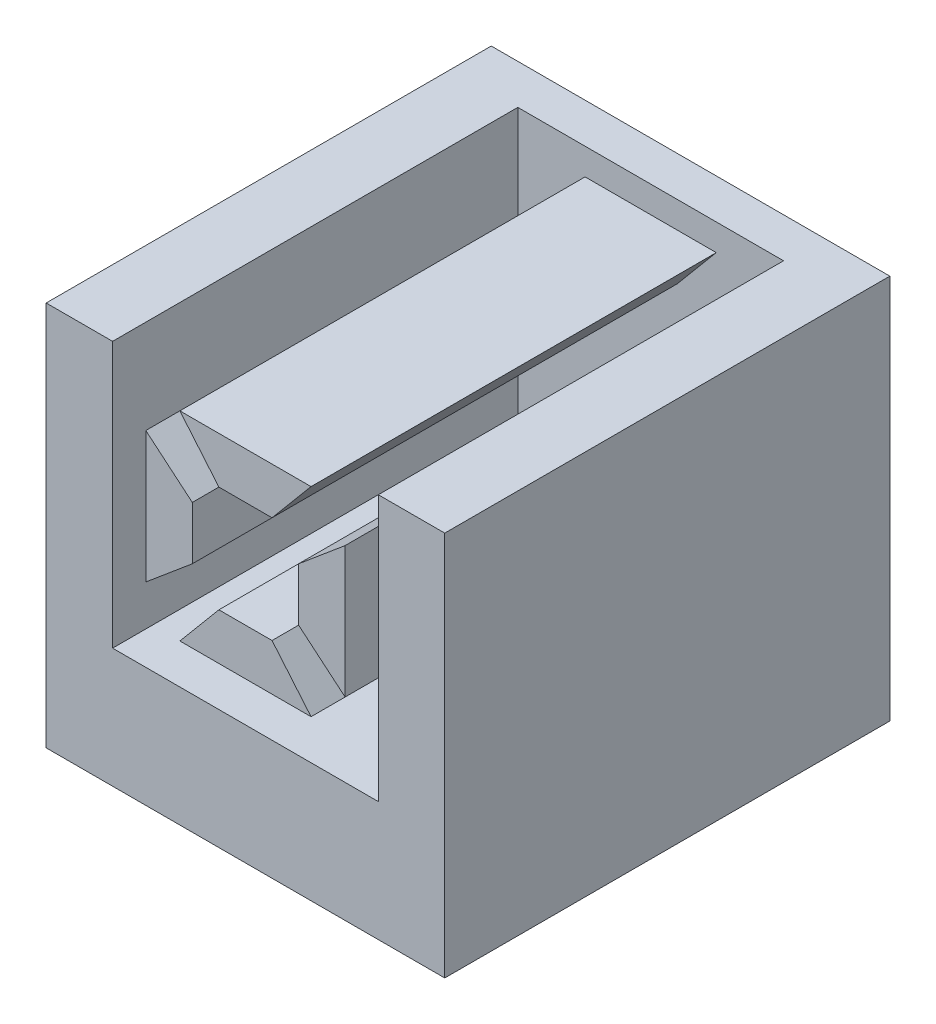
ISO-10303-21;
HEADER;
FILE_DESCRIPTION(('STEP AP214'),'2;1');
FILE_NAME('part.step','',(''),(''),'','','');
FILE_SCHEMA(('AUTOMOTIVE_DESIGN { 1 0 10303 214 1 1 1 1 }'));
ENDSEC;
DATA;
#1=APPLICATION_CONTEXT('core data for automotive mechanical design processes');
#2=APPLICATION_PROTOCOL_DEFINITION('international standard','automotive_design',2000,#1);
#3=PRODUCT_CONTEXT('',#1,'mechanical');
#4=PRODUCT('Part','Part','',(#3));
#5=PRODUCT_RELATED_PRODUCT_CATEGORY('part','',(#4));
#6=PRODUCT_DEFINITION_FORMATION('','',#4);
#7=PRODUCT_DEFINITION_CONTEXT('part definition',#1,'design');
#8=PRODUCT_DEFINITION('design','',#6,#7);
#9=PRODUCT_DEFINITION_SHAPE('','',#8);
#10=(LENGTH_UNIT() NAMED_UNIT(*) SI_UNIT(.MILLI.,.METRE.));
#11=(NAMED_UNIT(*) PLANE_ANGLE_UNIT() SI_UNIT($,.RADIAN.));
#12=(NAMED_UNIT(*) SI_UNIT($,.STERADIAN.) SOLID_ANGLE_UNIT());
#13=UNCERTAINTY_MEASURE_WITH_UNIT(LENGTH_MEASURE(1.E-05),#10,'distance_accuracy_value','');
#14=(GEOMETRIC_REPRESENTATION_CONTEXT(3) GLOBAL_UNCERTAINTY_ASSIGNED_CONTEXT((#13)) GLOBAL_UNIT_ASSIGNED_CONTEXT((#10,
#11,#12)) REPRESENTATION_CONTEXT('',''));
#15=CARTESIAN_POINT('',(0.,0.,0.));
#16=DIRECTION('',(0.,0.,1.));
#17=DIRECTION('',(1.,0.,0.));
#18=AXIS2_PLACEMENT_3D('',#15,#16,#17);
#19=CARTESIAN_POINT('',(2.92076173337084,-3.48082828885636,-17.5));
#20=DIRECTION('',(-0.642787609686543,0.766044443118975,0.));
#21=DIRECTION('',(-0.766044443118975,-0.642787609686543,0.));
#22=AXIS2_PLACEMENT_3D('',#19,#20,#21);
#23=PLANE('',#22);
#24=DIRECTION('',(0.,0.,1.));
#25=VECTOR('',#24,1.);
#26=CARTESIAN_POINT('',(35.,23.4368487091205,-17.5));
#27=LINE('',#26,#25);
#28=CARTESIAN_POINT('',(35.,23.4368487091205,-14.5));
#29=VERTEX_POINT('',#28);
#30=CARTESIAN_POINT('',(35.,23.4368487091205,16.));
#31=VERTEX_POINT('',#30);
#32=EDGE_CURVE('E290',#29,#31,#27,.T.);
#33=ORIENTED_EDGE('',*,*,#32,.F.);
#34=DIRECTION('',(0.766044443118975,0.642787609686543,0.));
#35=VECTOR('',#34,1.);
#36=CARTESIAN_POINT('',(2.92076173337084,-3.48082828885636,-14.5));
#37=LINE('',#36,#35);
#38=CARTESIAN_POINT('',(31.5,20.5,-14.5));
#39=VERTEX_POINT('',#38);
#40=EDGE_CURVE('E107',#39,#29,#37,.T.);
#41=ORIENTED_EDGE('',*,*,#40,.F.);
#42=DIRECTION('',(0.,0.,1.));
#43=VECTOR('',#42,1.);
#44=CARTESIAN_POINT('',(31.5,20.5,-17.5));
#45=LINE('',#44,#43);
#46=CARTESIAN_POINT('',(31.5,20.5,16.));
#47=VERTEX_POINT('',#46);
#48=EDGE_CURVE('E294',#39,#47,#45,.T.);
#49=ORIENTED_EDGE('',*,*,#48,.T.);
#50=DIRECTION('',(0.766044443118975,0.642787609686543,0.));
#51=VECTOR('',#50,1.);
#52=CARTESIAN_POINT('',(2.92076173337084,-3.48082828885636,16.));
#53=LINE('',#52,#51);
#54=EDGE_CURVE('E470',#47,#31,#53,.T.);
#55=ORIENTED_EDGE('',*,*,#54,.T.);
#56=EDGE_LOOP('',(#33,#41,#49,#55));
#57=FACE_BOUND('',#56,.T.);
#58=ADVANCED_FACE('F90',(#57),#23,.T.);
#59=CARTESIAN_POINT('',(35.,0.,-17.5));
#60=DIRECTION('',(1.,0.,0.));
#61=DIRECTION('',(0.,0.,-1.));
#62=AXIS2_PLACEMENT_3D('',#59,#60,#61);
#63=PLANE('',#62);
#64=DIRECTION('',(0.,-1.,0.));
#65=VECTOR('',#64,1.);
#66=CARTESIAN_POINT('',(35.,0.,-14.5));
#67=LINE('',#66,#65);
#68=CARTESIAN_POINT('',(35.,13.5631512908795,-14.5));
#69=VERTEX_POINT('',#68);
#70=EDGE_CURVE('E292',#29,#69,#67,.T.);
#71=ORIENTED_EDGE('',*,*,#70,.F.);
#72=ORIENTED_EDGE('',*,*,#32,.T.);
#73=DIRECTION('',(0.,-1.,0.));
#74=VECTOR('',#73,1.);
#75=CARTESIAN_POINT('',(35.,0.,16.));
#76=LINE('',#75,#74);
#77=CARTESIAN_POINT('',(35.,13.5631512908795,16.));
#78=VERTEX_POINT('',#77);
#79=EDGE_CURVE('E477',#31,#78,#76,.T.);
#80=ORIENTED_EDGE('',*,*,#79,.T.);
#81=DIRECTION('',(0.,0.,1.));
#82=VECTOR('',#81,1.);
#83=CARTESIAN_POINT('',(35.,13.5631512908795,-17.5));
#84=LINE('',#83,#82);
#85=EDGE_CURVE('E293',#69,#78,#84,.T.);
#86=ORIENTED_EDGE('',*,*,#85,.F.);
#87=EDGE_LOOP('',(#71,#72,#80,#86));
#88=FACE_BOUND('',#87,.T.);
#89=ADVANCED_FACE('F437',(#88),#63,.T.);
#90=CARTESIAN_POINT('',(7.82415805591499,-6.56524813899094,-17.5));
#91=DIRECTION('',(0.766044443118981,-0.642787609686535,0.));
#92=DIRECTION('',(0.642787609686535,0.766044443118981,0.));
#93=AXIS2_PLACEMENT_3D('',#90,#91,#92);
#94=PLANE('',#93);
#95=DIRECTION('',(-0.642787609686535,-0.766044443118981,0.));
#96=VECTOR('',#95,1.);
#97=CARTESIAN_POINT('',(7.82415805591499,-6.56524813899094,-14.5));
#98=LINE('',#97,#96);
#99=CARTESIAN_POINT('',(25.5,14.5,-14.5));
#100=VERTEX_POINT('',#99);
#101=CARTESIAN_POINT('',(22.5631512908795,11.,-14.5));
#102=VERTEX_POINT('',#101);
#103=EDGE_CURVE('E267',#100,#102,#98,.T.);
#104=ORIENTED_EDGE('',*,*,#103,.T.);
#105=DIRECTION('',(0.,0.,1.));
#106=VECTOR('',#105,1.);
#107=CARTESIAN_POINT('',(22.5631512908795,11.,-17.5));
#108=LINE('',#107,#106);
#109=CARTESIAN_POINT('',(22.5631512908795,11.,16.));
#110=VERTEX_POINT('',#109);
#111=EDGE_CURVE('E274',#102,#110,#108,.T.);
#112=ORIENTED_EDGE('',*,*,#111,.T.);
#113=DIRECTION('',(-0.642787609686535,-0.766044443118981,0.));
#114=VECTOR('',#113,1.);
#115=CARTESIAN_POINT('',(7.82415805591499,-6.56524813899094,16.));
#116=LINE('',#115,#114);
#117=CARTESIAN_POINT('',(25.5,14.5,16.));
#118=VERTEX_POINT('',#117);
#119=EDGE_CURVE('E483',#118,#110,#116,.T.);
#120=ORIENTED_EDGE('',*,*,#119,.F.);
#121=DIRECTION('',(0.,0.,1.));
#122=VECTOR('',#121,1.);
#123=CARTESIAN_POINT('',(25.5,14.5,-17.5));
#124=LINE('',#123,#122);
#125=EDGE_CURVE('E545',#100,#118,#124,.T.);
#126=ORIENTED_EDGE('',*,*,#125,.F.);
#127=EDGE_LOOP('',(#104,#112,#120,#126));
#128=FACE_BOUND('',#127,.T.);
#129=ADVANCED_FACE('F434',(#128),#94,.F.);
#130=CARTESIAN_POINT('',(24.4511668299259,20.5169650688447,-17.5));
#131=DIRECTION('',(-0.766044443118983,-0.642787609686534,0.));
#132=DIRECTION('',(0.642787609686534,-0.766044443118983,0.));
#133=AXIS2_PLACEMENT_3D('',#130,#131,#132);
#134=PLANE('',#133);
#135=DIRECTION('',(0.,0.,1.));
#136=VECTOR('',#135,1.);
#137=CARTESIAN_POINT('',(32.4368487091204,11.,-17.5));
#138=LINE('',#137,#136);
#139=CARTESIAN_POINT('',(32.4368487091204,11.,-14.5));
#140=VERTEX_POINT('',#139);
#141=CARTESIAN_POINT('',(32.4368487091204,11.,16.));
#142=VERTEX_POINT('',#141);
#143=EDGE_CURVE('E268',#140,#142,#138,.T.);
#144=ORIENTED_EDGE('',*,*,#143,.F.);
#145=DIRECTION('',(-0.642787609686534,0.766044443118983,0.));
#146=VECTOR('',#145,1.);
#147=CARTESIAN_POINT('',(24.4511668299259,20.5169650688447,-14.5));
#148=LINE('',#147,#146);
#149=CARTESIAN_POINT('',(29.5,14.5,-14.5));
#150=VERTEX_POINT('',#149);
#151=EDGE_CURVE('E255',#140,#150,#148,.T.);
#152=ORIENTED_EDGE('',*,*,#151,.T.);
#153=DIRECTION('',(0.,0.,1.));
#154=VECTOR('',#153,1.);
#155=CARTESIAN_POINT('',(29.5,14.5,-17.5));
#156=LINE('',#155,#154);
#157=CARTESIAN_POINT('',(29.5,14.5,16.));
#158=VERTEX_POINT('',#157);
#159=EDGE_CURVE('E281',#150,#158,#156,.T.);
#160=ORIENTED_EDGE('',*,*,#159,.T.);
#161=DIRECTION('',(-0.642787609686534,0.766044443118983,0.));
#162=VECTOR('',#161,1.);
#163=CARTESIAN_POINT('',(24.4511668299259,20.5169650688447,16.));
#164=LINE('',#163,#162);
#165=EDGE_CURVE('E280',#142,#158,#164,.T.);
#166=ORIENTED_EDGE('',*,*,#165,.F.);
#167=EDGE_LOOP('',(#144,#152,#160,#166));
#168=FACE_BOUND('',#167,.T.);
#169=ADVANCED_FACE('F279',(#168),#134,.F.);
#170=CARTESIAN_POINT('',(0.,11.,-17.5));
#171=DIRECTION('',(0.,1.,0.));
#172=DIRECTION('',(-1.,0.,0.));
#173=AXIS2_PLACEMENT_3D('',#170,#171,#172);
#174=PLANE('',#173);
#175=DIRECTION('',(-1.,0.,0.));
#176=VECTOR('',#175,1.);
#177=CARTESIAN_POINT('',(0.,11.,-14.5));
#178=LINE('',#177,#176);
#179=EDGE_CURVE('E259',#140,#102,#178,.T.);
#180=ORIENTED_EDGE('',*,*,#179,.F.);
#181=ORIENTED_EDGE('',*,*,#143,.T.);
#182=DIRECTION('',(1.,0.,0.));
#183=VECTOR('',#182,1.);
#184=CARTESIAN_POINT('',(0.,11.,16.));
#185=LINE('',#184,#183);
#186=EDGE_CURVE('E553',#110,#142,#185,.T.);
#187=ORIENTED_EDGE('',*,*,#186,.F.);
#188=ORIENTED_EDGE('',*,*,#111,.F.);
#189=EDGE_LOOP('',(#180,#181,#187,#188));
#190=FACE_BOUND('',#189,.T.);
#191=ADVANCED_FACE('F271',(#190),#174,.F.);
#192=CARTESIAN_POINT('',(32.4368487091204,26.,-17.5));
#193=DIRECTION('',(0.,-1.,0.));
#194=DIRECTION('',(0.,0.,-1.));
#195=AXIS2_PLACEMENT_3D('',#192,#193,#194);
#196=PLANE('',#195);
#197=DIRECTION('',(0.,0.,-1.));
#198=VECTOR('',#197,1.);
#199=CARTESIAN_POINT('',(32.4368487091204,26.,30.));
#200=LINE('',#199,#198);
#201=CARTESIAN_POINT('',(32.4368487091204,26.,16.));
#202=VERTEX_POINT('',#201);
#203=CARTESIAN_POINT('',(32.4368487091204,26.,-14.5));
#204=VERTEX_POINT('',#203);
#205=EDGE_CURVE('E534',#202,#204,#200,.T.);
#206=ORIENTED_EDGE('',*,*,#205,.T.);
#207=DIRECTION('',(-1.,0.,0.));
#208=VECTOR('',#207,1.);
#209=CARTESIAN_POINT('',(0.,26.,-14.5));
#210=LINE('',#209,#208);
#211=CARTESIAN_POINT('',(22.5631512908796,26.,-14.5));
#212=VERTEX_POINT('',#211);
#213=EDGE_CURVE('E115',#204,#212,#210,.T.);
#214=ORIENTED_EDGE('',*,*,#213,.T.);
#215=DIRECTION('',(0.,0.,-1.));
#216=VECTOR('',#215,1.);
#217=CARTESIAN_POINT('',(22.5631512908796,26.,30.));
#218=LINE('',#217,#216);
#219=CARTESIAN_POINT('',(22.5631512908796,26.,16.));
#220=VERTEX_POINT('',#219);
#221=EDGE_CURVE('E532',#220,#212,#218,.T.);
#222=ORIENTED_EDGE('',*,*,#221,.F.);
#223=DIRECTION('',(-1.,0.,0.));
#224=VECTOR('',#223,1.);
#225=CARTESIAN_POINT('',(32.4368487091204,26.,16.));
#226=LINE('',#225,#224);
#227=EDGE_CURVE('E561',#202,#220,#226,.T.);
#228=ORIENTED_EDGE('',*,*,#227,.F.);
#229=EDGE_LOOP('',(#206,#214,#222,#228));
#230=FACE_BOUND('',#229,.T.);
#231=ADVANCED_FACE('F419',(#230),#196,.F.);
#232=CARTESIAN_POINT('',(6.23222339920006,-5.22945635568313,30.));
#233=DIRECTION('',(-0.766044443118981,0.642787609686535,0.));
#234=DIRECTION('',(-0.642787609686535,-0.766044443118981,0.));
#235=AXIS2_PLACEMENT_3D('',#232,#233,#234);
#236=PLANE('',#235);
#237=DIRECTION('',(0.642787609686535,0.766044443118981,0.));
#238=VECTOR('',#237,1.);
#239=CARTESIAN_POINT('',(6.23222339920006,-5.22945635568313,-14.5));
#240=LINE('',#239,#238);
#241=CARTESIAN_POINT('',(29.5,22.5,-14.5));
#242=VERTEX_POINT('',#241);
#243=EDGE_CURVE('E531',#242,#204,#240,.T.);
#244=ORIENTED_EDGE('',*,*,#243,.T.);
#245=ORIENTED_EDGE('',*,*,#205,.F.);
#246=DIRECTION('',(0.642787609686535,0.766044443118982,0.));
#247=VECTOR('',#246,1.);
#248=CARTESIAN_POINT('',(6.23222339920006,-5.22945635568313,16.));
#249=LINE('',#248,#247);
#250=CARTESIAN_POINT('',(29.5,22.5,16.));
#251=VERTEX_POINT('',#250);
#252=EDGE_CURVE('E563',#251,#202,#249,.T.);
#253=ORIENTED_EDGE('',*,*,#252,.F.);
#254=DIRECTION('',(0.,0.,-1.));
#255=VECTOR('',#254,1.);
#256=CARTESIAN_POINT('',(29.5,22.5,30.));
#257=LINE('',#256,#255);
#258=EDGE_CURVE('E529',#251,#242,#257,.T.);
#259=ORIENTED_EDGE('',*,*,#258,.T.);
#260=EDGE_LOOP('',(#244,#245,#253,#259));
#261=FACE_BOUND('',#260,.T.);
#262=ADVANCED_FACE('F415',(#261),#236,.F.);
#263=CARTESIAN_POINT('',(17.5,28.,-17.5));
#264=DIRECTION('',(1.,0.,0.));
#265=DIRECTION('',(0.,1.,0.));
#266=AXIS2_PLACEMENT_3D('',#263,#264,#265);
#267=PLANE('',#266);
#268=DIRECTION('',(0.,0.,1.));
#269=VECTOR('',#268,1.);
#270=CARTESIAN_POINT('',(17.5,8.,-17.5));
#271=LINE('',#270,#269);
#272=CARTESIAN_POINT('',(17.5,8.,-14.5));
#273=VERTEX_POINT('',#272);
#274=CARTESIAN_POINT('',(17.5,8.,16.));
#275=VERTEX_POINT('',#274);
#276=EDGE_CURVE('E506',#273,#275,#271,.T.);
#277=ORIENTED_EDGE('',*,*,#276,.F.);
#278=DIRECTION('',(0.,-1.,0.));
#279=VECTOR('',#278,1.);
#280=CARTESIAN_POINT('',(17.5,0.,-14.5));
#281=LINE('',#280,#279);
#282=CARTESIAN_POINT('',(17.5,28.,-14.5));
#283=VERTEX_POINT('',#282);
#284=EDGE_CURVE('E526',#283,#273,#281,.T.);
#285=ORIENTED_EDGE('',*,*,#284,.F.);
#286=DIRECTION('',(0.,0.,1.));
#287=VECTOR('',#286,1.);
#288=CARTESIAN_POINT('',(17.5,28.,-17.5));
#289=LINE('',#288,#287);
#290=CARTESIAN_POINT('',(17.5,28.,16.));
#291=VERTEX_POINT('',#290);
#292=EDGE_CURVE('E511',#283,#291,#289,.T.);
#293=ORIENTED_EDGE('',*,*,#292,.T.);
#294=DIRECTION('',(0.,-1.,0.));
#295=VECTOR('',#294,1.);
#296=CARTESIAN_POINT('',(17.5,28.,16.));
#297=LINE('',#296,#295);
#298=EDGE_CURVE('E567',#291,#275,#297,.T.);
#299=ORIENTED_EDGE('',*,*,#298,.T.);
#300=EDGE_LOOP('',(#277,#285,#293,#299));
#301=FACE_BOUND('',#300,.T.);
#302=ADVANCED_FACE('F411',(#301),#267,.T.);
#303=CARTESIAN_POINT('',(37.5,28.,-17.5));
#304=DIRECTION('',(-1.,0.,0.));
#305=DIRECTION('',(0.,0.,1.));
#306=AXIS2_PLACEMENT_3D('',#303,#304,#305);
#307=PLANE('',#306);
#308=DIRECTION('',(0.,0.,1.));
#309=VECTOR('',#308,1.);
#310=CARTESIAN_POINT('',(37.5,28.,-17.5));
#311=LINE('',#310,#309);
#312=CARTESIAN_POINT('',(37.5,28.,-14.5));
#313=VERTEX_POINT('',#312);
#314=CARTESIAN_POINT('',(37.5,28.,16.));
#315=VERTEX_POINT('',#314);
#316=EDGE_CURVE('E498',#313,#315,#311,.T.);
#317=ORIENTED_EDGE('',*,*,#316,.F.);
#318=DIRECTION('',(0.,1.,0.));
#319=VECTOR('',#318,1.);
#320=CARTESIAN_POINT('',(37.5,0.,-14.5));
#321=LINE('',#320,#319);
#322=CARTESIAN_POINT('',(37.5,8.,-14.5));
#323=VERTEX_POINT('',#322);
#324=EDGE_CURVE('E502',#323,#313,#321,.T.);
#325=ORIENTED_EDGE('',*,*,#324,.F.);
#326=DIRECTION('',(0.,0.,1.));
#327=VECTOR('',#326,1.);
#328=CARTESIAN_POINT('',(37.5,8.,-17.5));
#329=LINE('',#328,#327);
#330=CARTESIAN_POINT('',(37.5,8.,16.));
#331=VERTEX_POINT('',#330);
#332=EDGE_CURVE('E514',#323,#331,#329,.T.);
#333=ORIENTED_EDGE('',*,*,#332,.T.);
#334=DIRECTION('',(0.,1.,0.));
#335=VECTOR('',#334,1.);
#336=CARTESIAN_POINT('',(37.5,28.,16.));
#337=LINE('',#336,#335);
#338=EDGE_CURVE('E570',#331,#315,#337,.T.);
#339=ORIENTED_EDGE('',*,*,#338,.T.);
#340=EDGE_LOOP('',(#317,#325,#333,#339));
#341=FACE_BOUND('',#340,.T.);
#342=ADVANCED_FACE('F407',(#341),#307,.T.);
#343=CARTESIAN_POINT('',(50.,8.,-5.));
#344=DIRECTION('',(0.,1.,0.));
#345=DIRECTION('',(0.,0.,1.));
#346=AXIS2_PLACEMENT_3D('',#343,#344,#345);
#347=PLANE('',#346);
#348=ORIENTED_EDGE('',*,*,#332,.F.);
#349=DIRECTION('',(-1.,0.,0.));
#350=VECTOR('',#349,1.);
#351=CARTESIAN_POINT('',(50.,8.,-14.5));
#352=LINE('',#351,#350);
#353=EDGE_CURVE('E275',#323,#273,#352,.T.);
#354=ORIENTED_EDGE('',*,*,#353,.T.);
#355=ORIENTED_EDGE('',*,*,#276,.T.);
#356=DIRECTION('',(1.,0.,0.));
#357=VECTOR('',#356,1.);
#358=CARTESIAN_POINT('',(50.,8.,16.));
#359=LINE('',#358,#357);
#360=EDGE_CURVE('E341',#275,#331,#359,.T.);
#361=ORIENTED_EDGE('',*,*,#360,.T.);
#362=EDGE_LOOP('',(#348,#354,#355,#361));
#363=FACE_BOUND('',#362,.T.);
#364=ADVANCED_FACE('F410',(#363),#347,.T.);
#365=CARTESIAN_POINT('',(23.5,22.5,-17.5));
#366=DIRECTION('',(-1.,0.,0.));
#367=DIRECTION('',(0.,0.,1.));
#368=AXIS2_PLACEMENT_3D('',#365,#366,#367);
#369=PLANE('',#368);
#370=DIRECTION('',(0.,1.,0.));
#371=VECTOR('',#370,1.);
#372=CARTESIAN_POINT('',(23.5,22.5,16.));
#373=LINE('',#372,#371);
#374=CARTESIAN_POINT('',(23.5,16.5,16.));
#375=VERTEX_POINT('',#374);
#376=CARTESIAN_POINT('',(23.5,20.5,16.));
#377=VERTEX_POINT('',#376);
#378=EDGE_CURVE('E494',#375,#377,#373,.T.);
#379=ORIENTED_EDGE('',*,*,#378,.F.);
#380=DIRECTION('',(0.,0.,1.));
#381=VECTOR('',#380,1.);
#382=CARTESIAN_POINT('',(23.5,16.5,-17.5));
#383=LINE('',#382,#381);
#384=CARTESIAN_POINT('',(23.5,16.5,-14.5));
#385=VERTEX_POINT('',#384);
#386=EDGE_CURVE('E333',#385,#375,#383,.T.);
#387=ORIENTED_EDGE('',*,*,#386,.F.);
#388=DIRECTION('',(0.,-1.,0.));
#389=VECTOR('',#388,1.);
#390=CARTESIAN_POINT('',(23.5,22.5,-14.5));
#391=LINE('',#390,#389);
#392=CARTESIAN_POINT('',(23.5,20.5,-14.5));
#393=VERTEX_POINT('',#392);
#394=EDGE_CURVE('E324',#393,#385,#391,.T.);
#395=ORIENTED_EDGE('',*,*,#394,.F.);
#396=DIRECTION('',(0.,0.,1.));
#397=VECTOR('',#396,1.);
#398=CARTESIAN_POINT('',(23.5,20.5,-17.5));
#399=LINE('',#398,#397);
#400=EDGE_CURVE('E327',#393,#377,#399,.T.);
#401=ORIENTED_EDGE('',*,*,#400,.T.);
#402=EDGE_LOOP('',(#379,#387,#395,#401));
#403=FACE_BOUND('',#402,.T.);
#404=ADVANCED_FACE('F642',(#403),#369,.F.);
#405=CARTESIAN_POINT('',(1.58496995006294,-1.88889363214136,-17.5));
#406=DIRECTION('',(0.642787609686543,-0.766044443118975,0.));
#407=DIRECTION('',(0.766044443118975,0.642787609686543,0.));
#408=AXIS2_PLACEMENT_3D('',#405,#406,#407);
#409=PLANE('',#408);
#410=ORIENTED_EDGE('',*,*,#386,.T.);
#411=DIRECTION('',(-0.766044443118975,-0.642787609686543,0.));
#412=VECTOR('',#411,1.);
#413=CARTESIAN_POINT('',(1.58496995006294,-1.88889363214136,16.));
#414=LINE('',#413,#412);
#415=CARTESIAN_POINT('',(20.,13.5631512908795,16.));
#416=VERTEX_POINT('',#415);
#417=EDGE_CURVE('E491',#375,#416,#414,.T.);
#418=ORIENTED_EDGE('',*,*,#417,.T.);
#419=DIRECTION('',(0.,0.,1.));
#420=VECTOR('',#419,1.);
#421=CARTESIAN_POINT('',(20.,13.5631512908795,-17.5));
#422=LINE('',#421,#420);
#423=CARTESIAN_POINT('',(20.,13.5631512908795,-14.5));
#424=VERTEX_POINT('',#423);
#425=EDGE_CURVE('E328',#424,#416,#422,.T.);
#426=ORIENTED_EDGE('',*,*,#425,.F.);
#427=DIRECTION('',(0.766044443118975,0.642787609686543,0.));
#428=VECTOR('',#427,1.);
#429=CARTESIAN_POINT('',(1.58496995006294,-1.88889363214136,-14.5));
#430=LINE('',#429,#428);
#431=EDGE_CURVE('E322',#424,#385,#430,.T.);
#432=ORIENTED_EDGE('',*,*,#431,.T.);
#433=EDGE_LOOP('',(#410,#418,#426,#432));
#434=FACE_BOUND('',#433,.T.);
#435=ADVANCED_FACE('F647',(#434),#409,.T.);
#436=CARTESIAN_POINT('',(19.8039133807888,23.6013849189794,-17.5));
#437=DIRECTION('',(-0.642787609686544,-0.766044443118975,0.));
#438=DIRECTION('',(0.766044443118975,-0.642787609686544,0.));
#439=AXIS2_PLACEMENT_3D('',#436,#437,#438);
#440=PLANE('',#439);
#441=DIRECTION('',(-0.766044443118975,0.642787609686544,0.));
#442=VECTOR('',#441,1.);
#443=CARTESIAN_POINT('',(19.8039133807888,23.6013849189794,16.));
#444=LINE('',#443,#442);
#445=CARTESIAN_POINT('',(20.,23.4368487091205,16.));
#446=VERTEX_POINT('',#445);
#447=EDGE_CURVE('E489',#377,#446,#444,.T.);
#448=ORIENTED_EDGE('',*,*,#447,.F.);
#449=ORIENTED_EDGE('',*,*,#400,.F.);
#450=DIRECTION('',(0.766044443118975,-0.642787609686544,0.));
#451=VECTOR('',#450,1.);
#452=CARTESIAN_POINT('',(19.8039133807888,23.6013849189794,-14.5));
#453=LINE('',#452,#451);
#454=CARTESIAN_POINT('',(20.,23.4368487091205,-14.5));
#455=VERTEX_POINT('',#454);
#456=EDGE_CURVE('E319',#455,#393,#453,.T.);
#457=ORIENTED_EDGE('',*,*,#456,.F.);
#458=DIRECTION('',(0.,0.,1.));
#459=VECTOR('',#458,1.);
#460=CARTESIAN_POINT('',(20.,23.4368487091205,-17.5));
#461=LINE('',#460,#459);
#462=EDGE_CURVE('E332',#455,#446,#461,.T.);
#463=ORIENTED_EDGE('',*,*,#462,.T.);
#464=EDGE_LOOP('',(#448,#449,#457,#463));
#465=FACE_BOUND('',#464,.T.);
#466=ADVANCED_FACE('F640',(#465),#440,.F.);
#467=CARTESIAN_POINT('',(20.,0.,-17.5));
#468=DIRECTION('',(1.,0.,0.));
#469=DIRECTION('',(0.,1.,0.));
#470=AXIS2_PLACEMENT_3D('',#467,#468,#469);
#471=PLANE('',#470);
#472=DIRECTION('',(0.,-1.,0.));
#473=VECTOR('',#472,1.);
#474=CARTESIAN_POINT('',(20.,0.,16.));
#475=LINE('',#474,#473);
#476=EDGE_CURVE('E469',#446,#416,#475,.T.);
#477=ORIENTED_EDGE('',*,*,#476,.F.);
#478=ORIENTED_EDGE('',*,*,#462,.F.);
#479=DIRECTION('',(0.,1.,0.));
#480=VECTOR('',#479,1.);
#481=CARTESIAN_POINT('',(20.,0.,-14.5));
#482=LINE('',#481,#480);
#483=EDGE_CURVE('E331',#424,#455,#482,.T.);
#484=ORIENTED_EDGE('',*,*,#483,.F.);
#485=ORIENTED_EDGE('',*,*,#425,.T.);
#486=EDGE_LOOP('',(#477,#478,#484,#485));
#487=FACE_BOUND('',#486,.T.);
#488=ADVANCED_FACE('F461',(#487),#471,.F.);
#489=CARTESIAN_POINT('',(12.4999999999997,0.,-14.5));
#490=DIRECTION('',(1.,0.,0.));
#491=DIRECTION('',(0.,0.,-1.));
#492=AXIS2_PLACEMENT_3D('',#489,#490,#491);
#493=PLANE('',#492);
#494=DIRECTION('',(0.,-1.,0.));
#495=VECTOR('',#494,1.);
#496=CARTESIAN_POINT('',(12.4999999999997,0.,-17.5));
#497=LINE('',#496,#495);
#498=CARTESIAN_POINT('',(12.4999999999997,28.,-17.5));
#499=VERTEX_POINT('',#498);
#500=CARTESIAN_POINT('',(12.4999999999997,-1.,-17.5));
#501=VERTEX_POINT('',#500);
#502=EDGE_CURVE('E309',#499,#501,#497,.T.);
#503=ORIENTED_EDGE('',*,*,#502,.T.);
#504=DIRECTION('',(0.,0.,-1.));
#505=VECTOR('',#504,1.);
#506=CARTESIAN_POINT('',(12.4999999999997,-1.,26.));
#507=LINE('',#506,#505);
#508=CARTESIAN_POINT('',(12.4999999999997,-1.00000000000001,16.));
#509=VERTEX_POINT('',#508);
#510=EDGE_CURVE('E512',#509,#501,#507,.T.);
#511=ORIENTED_EDGE('',*,*,#510,.F.);
#512=DIRECTION('',(0.,1.,0.));
#513=VECTOR('',#512,1.);
#514=CARTESIAN_POINT('',(12.4999999999997,-21.,16.));
#515=LINE('',#514,#513);
#516=CARTESIAN_POINT('',(12.4999999999997,28.,16.));
#517=VERTEX_POINT('',#516);
#518=EDGE_CURVE('E573',#509,#517,#515,.T.);
#519=ORIENTED_EDGE('',*,*,#518,.T.);
#520=DIRECTION('',(0.,0.,-1.));
#521=VECTOR('',#520,1.);
#522=CARTESIAN_POINT('',(12.4999999999997,28.,-14.5));
#523=LINE('',#522,#521);
#524=EDGE_CURVE('E312',#517,#499,#523,.T.);
#525=ORIENTED_EDGE('',*,*,#524,.T.);
#526=EDGE_LOOP('',(#503,#511,#519,#525));
#527=FACE_BOUND('',#526,.T.);
#528=ADVANCED_FACE('F455',(#527),#493,.F.);
#529=CARTESIAN_POINT('',(31.5,22.5,-17.5));
#530=DIRECTION('',(1.,0.,0.));
#531=DIRECTION('',(0.,0.,-1.));
#532=AXIS2_PLACEMENT_3D('',#529,#530,#531);
#533=PLANE('',#532);
#534=DIRECTION('',(0.,-1.,0.));
#535=VECTOR('',#534,1.);
#536=CARTESIAN_POINT('',(31.5,22.5,16.));
#537=LINE('',#536,#535);
#538=CARTESIAN_POINT('',(31.5,16.5,16.));
#539=VERTEX_POINT('',#538);
#540=EDGE_CURVE('E465',#47,#539,#537,.T.);
#541=ORIENTED_EDGE('',*,*,#540,.F.);
#542=ORIENTED_EDGE('',*,*,#48,.F.);
#543=DIRECTION('',(0.,-1.,0.));
#544=VECTOR('',#543,1.);
#545=CARTESIAN_POINT('',(31.5,0.,-14.5));
#546=LINE('',#545,#544);
#547=CARTESIAN_POINT('',(31.5,16.5,-14.5));
#548=VERTEX_POINT('',#547);
#549=EDGE_CURVE('E306',#39,#548,#546,.T.);
#550=ORIENTED_EDGE('',*,*,#549,.T.);
#551=DIRECTION('',(0.,0.,1.));
#552=VECTOR('',#551,1.);
#553=CARTESIAN_POINT('',(31.5,16.5,-17.5));
#554=LINE('',#553,#552);
#555=EDGE_CURVE('E289',#548,#539,#554,.T.);
#556=ORIENTED_EDGE('',*,*,#555,.T.);
#557=EDGE_LOOP('',(#541,#542,#550,#556));
#558=FACE_BOUND('',#557,.T.);
#559=ADVANCED_FACE('F452',(#558),#533,.F.);
#560=CARTESIAN_POINT('',(21.1397051640967,25.1933195756944,-17.5));
#561=DIRECTION('',(0.642787609686543,0.766044443118975,0.));
#562=DIRECTION('',(-0.766044443118975,0.642787609686543,0.));
#563=AXIS2_PLACEMENT_3D('',#560,#561,#562);
#564=PLANE('',#563);
#565=DIRECTION('',(0.766044443118975,-0.642787609686543,0.));
#566=VECTOR('',#565,1.);
#567=CARTESIAN_POINT('',(21.1397051640967,25.1933195756944,16.));
#568=LINE('',#567,#566);
#569=EDGE_CURVE('E479',#539,#78,#568,.T.);
#570=ORIENTED_EDGE('',*,*,#569,.F.);
#571=ORIENTED_EDGE('',*,*,#555,.F.);
#572=DIRECTION('',(0.766044443118975,-0.642787609686543,0.));
#573=VECTOR('',#572,1.);
#574=CARTESIAN_POINT('',(21.1397051640967,25.1933195756944,-14.5));
#575=LINE('',#574,#573);
#576=EDGE_CURVE('E302',#548,#69,#575,.T.);
#577=ORIENTED_EDGE('',*,*,#576,.T.);
#578=ORIENTED_EDGE('',*,*,#85,.T.);
#579=EDGE_LOOP('',(#570,#571,#577,#578));
#580=FACE_BOUND('',#579,.T.);
#581=ADVANCED_FACE('F443',(#580),#564,.F.);
#582=CARTESIAN_POINT('',(23.5,14.5,-17.5));
#583=DIRECTION('',(0.,-1.,0.));
#584=DIRECTION('',(0.,0.,-1.));
#585=AXIS2_PLACEMENT_3D('',#582,#583,#584);
#586=PLANE('',#585);
#587=DIRECTION('',(-1.,0.,0.));
#588=VECTOR('',#587,1.);
#589=CARTESIAN_POINT('',(23.5,14.5,16.));
#590=LINE('',#589,#588);
#591=EDGE_CURVE('E480',#158,#118,#590,.T.);
#592=ORIENTED_EDGE('',*,*,#591,.F.);
#593=ORIENTED_EDGE('',*,*,#159,.F.);
#594=DIRECTION('',(-1.,0.,0.));
#595=VECTOR('',#594,1.);
#596=CARTESIAN_POINT('',(0.,14.5,-14.5));
#597=LINE('',#596,#595);
#598=EDGE_CURVE('E262',#150,#100,#597,.T.);
#599=ORIENTED_EDGE('',*,*,#598,.T.);
#600=ORIENTED_EDGE('',*,*,#125,.T.);
#601=EDGE_LOOP('',(#592,#593,#599,#600));
#602=FACE_BOUND('',#601,.T.);
#603=ADVANCED_FACE('F430',(#602),#586,.F.);
#604=CARTESIAN_POINT('',(23.5,22.5,-17.5));
#605=DIRECTION('',(0.,1.,0.));
#606=DIRECTION('',(0.,0.,1.));
#607=AXIS2_PLACEMENT_3D('',#604,#605,#606);
#608=PLANE('',#607);
#609=DIRECTION('',(1.,0.,0.));
#610=VECTOR('',#609,1.);
#611=CARTESIAN_POINT('',(23.5,22.5,16.));
#612=LINE('',#611,#610);
#613=CARTESIAN_POINT('',(25.5,22.5,16.));
#614=VERTEX_POINT('',#613);
#615=EDGE_CURVE('E557',#614,#251,#612,.T.);
#616=ORIENTED_EDGE('',*,*,#615,.F.);
#617=DIRECTION('',(0.,0.,-1.));
#618=VECTOR('',#617,1.);
#619=CARTESIAN_POINT('',(25.5,22.5,30.));
#620=LINE('',#619,#618);
#621=CARTESIAN_POINT('',(25.5,22.5,-14.5));
#622=VERTEX_POINT('',#621);
#623=EDGE_CURVE('E528',#614,#622,#620,.T.);
#624=ORIENTED_EDGE('',*,*,#623,.T.);
#625=DIRECTION('',(1.,0.,0.));
#626=VECTOR('',#625,1.);
#627=CARTESIAN_POINT('',(0.,22.5,-14.5));
#628=LINE('',#627,#626);
#629=EDGE_CURVE('E543',#622,#242,#628,.T.);
#630=ORIENTED_EDGE('',*,*,#629,.T.);
#631=ORIENTED_EDGE('',*,*,#258,.F.);
#632=EDGE_LOOP('',(#616,#624,#630,#631));
#633=FACE_BOUND('',#632,.T.);
#634=ADVANCED_FACE('F423',(#633),#608,.F.);
#635=CARTESIAN_POINT('',(26.0431014866408,21.8527568521525,30.));
#636=DIRECTION('',(0.766044443118982,0.642787609686534,0.));
#637=DIRECTION('',(-0.642787609686534,0.766044443118982,0.));
#638=AXIS2_PLACEMENT_3D('',#635,#636,#637);
#639=PLANE('',#638);
#640=DIRECTION('',(0.642787609686534,-0.766044443118982,0.));
#641=VECTOR('',#640,1.);
#642=CARTESIAN_POINT('',(26.0431014866408,21.8527568521525,16.));
#643=LINE('',#642,#641);
#644=EDGE_CURVE('E554',#220,#614,#643,.T.);
#645=ORIENTED_EDGE('',*,*,#644,.F.);
#646=ORIENTED_EDGE('',*,*,#221,.T.);
#647=DIRECTION('',(0.642787609686534,-0.766044443118982,0.));
#648=VECTOR('',#647,1.);
#649=CARTESIAN_POINT('',(26.0431014866408,21.8527568521525,-14.5));
#650=LINE('',#649,#648);
#651=EDGE_CURVE('E539',#212,#622,#650,.T.);
#652=ORIENTED_EDGE('',*,*,#651,.T.);
#653=ORIENTED_EDGE('',*,*,#623,.F.);
#654=EDGE_LOOP('',(#645,#646,#652,#653));
#655=FACE_BOUND('',#654,.T.);
#656=ADVANCED_FACE('F405',(#655),#639,.F.);
#657=CARTESIAN_POINT('',(38.5,28.,0.));
#658=DIRECTION('',(0.,-1.,0.));
#659=DIRECTION('',(0.,0.,-1.));
#660=AXIS2_PLACEMENT_3D('',#657,#658,#659);
#661=PLANE('',#660);
#662=DIRECTION('',(0.,0.,-1.));
#663=VECTOR('',#662,1.);
#664=CARTESIAN_POINT('',(42.5,28.,30.));
#665=LINE('',#664,#663);
#666=CARTESIAN_POINT('',(42.5,28.,16.));
#667=VERTEX_POINT('',#666);
#668=CARTESIAN_POINT('',(42.5,28.,-17.5));
#669=VERTEX_POINT('',#668);
#670=EDGE_CURVE('E496',#667,#669,#665,.T.);
#671=ORIENTED_EDGE('',*,*,#670,.T.);
#672=DIRECTION('',(1.,0.,0.));
#673=VECTOR('',#672,1.);
#674=CARTESIAN_POINT('',(0.,28.,-17.5));
#675=LINE('',#674,#673);
#676=EDGE_CURVE('E313',#499,#669,#675,.T.);
#677=ORIENTED_EDGE('',*,*,#676,.F.);
#678=ORIENTED_EDGE('',*,*,#524,.F.);
#679=DIRECTION('',(1.,0.,0.));
#680=VECTOR('',#679,1.);
#681=CARTESIAN_POINT('',(0.,28.,16.));
#682=LINE('',#681,#680);
#683=EDGE_CURVE('E576',#517,#291,#682,.T.);
#684=ORIENTED_EDGE('',*,*,#683,.T.);
#685=ORIENTED_EDGE('',*,*,#292,.F.);
#686=DIRECTION('',(1.,0.,0.));
#687=VECTOR('',#686,1.);
#688=CARTESIAN_POINT('',(0.,28.,-14.5));
#689=LINE('',#688,#687);
#690=EDGE_CURVE('E310',#283,#313,#689,.T.);
#691=ORIENTED_EDGE('',*,*,#690,.T.);
#692=ORIENTED_EDGE('',*,*,#316,.T.);
#693=EDGE_CURVE('E581',#315,#667,#682,.T.);
#694=ORIENTED_EDGE('',*,*,#693,.T.);
#695=EDGE_LOOP('',(#671,#677,#678,#684,#685,#691,#692,#694));
#696=FACE_BOUND('',#695,.T.);
#697=ADVANCED_FACE('F402',(#696),#661,.F.);
#698=CARTESIAN_POINT('',(50.,-1.,-5.));
#699=DIRECTION('',(0.,1.,0.));
#700=DIRECTION('',(0.,0.,1.));
#701=AXIS2_PLACEMENT_3D('',#698,#699,#700);
#702=PLANE('',#701);
#703=DIRECTION('',(-1.,0.,0.));
#704=VECTOR('',#703,1.);
#705=CARTESIAN_POINT('',(50.,-1.,-17.5));
#706=LINE('',#705,#704);
#707=CARTESIAN_POINT('',(42.5,-1.,-17.5));
#708=VERTEX_POINT('',#707);
#709=EDGE_CURVE('E510',#708,#501,#706,.T.);
#710=ORIENTED_EDGE('',*,*,#709,.F.);
#711=DIRECTION('',(0.,0.,-1.));
#712=VECTOR('',#711,1.);
#713=CARTESIAN_POINT('',(42.5,-1.,26.));
#714=LINE('',#713,#712);
#715=CARTESIAN_POINT('',(42.5,-1.,16.));
#716=VERTEX_POINT('',#715);
#717=EDGE_CURVE('E515',#716,#708,#714,.T.);
#718=ORIENTED_EDGE('',*,*,#717,.F.);
#719=DIRECTION('',(1.,0.,0.));
#720=VECTOR('',#719,1.);
#721=CARTESIAN_POINT('',(50.,-1.,16.));
#722=LINE('',#721,#720);
#723=EDGE_CURVE('E565',#509,#716,#722,.T.);
#724=ORIENTED_EDGE('',*,*,#723,.F.);
#725=ORIENTED_EDGE('',*,*,#510,.T.);
#726=EDGE_LOOP('',(#710,#718,#724,#725));
#727=FACE_BOUND('',#726,.T.);
#728=ADVANCED_FACE('F400',(#727),#702,.F.);
#729=CARTESIAN_POINT('',(42.5,26.,0.));
#730=DIRECTION('',(1.,0.,0.));
#731=DIRECTION('',(0.,0.,-1.));
#732=AXIS2_PLACEMENT_3D('',#729,#730,#731);
#733=PLANE('',#732);
#734=DIRECTION('',(0.,-1.,0.));
#735=VECTOR('',#734,1.);
#736=CARTESIAN_POINT('',(42.5,26.,-17.5));
#737=LINE('',#736,#735);
#738=EDGE_CURVE('E507',#669,#708,#737,.T.);
#739=ORIENTED_EDGE('',*,*,#738,.F.);
#740=ORIENTED_EDGE('',*,*,#670,.F.);
#741=DIRECTION('',(0.,1.,0.));
#742=VECTOR('',#741,1.);
#743=CARTESIAN_POINT('',(42.5,-21.,16.));
#744=LINE('',#743,#742);
#745=EDGE_CURVE('E574',#716,#667,#744,.T.);
#746=ORIENTED_EDGE('',*,*,#745,.F.);
#747=ORIENTED_EDGE('',*,*,#717,.T.);
#748=EDGE_LOOP('',(#739,#740,#746,#747));
#749=FACE_BOUND('',#748,.T.);
#750=ADVANCED_FACE('F377',(#749),#733,.T.);
#751=CARTESIAN_POINT('',(0.,0.,-14.5));
#752=DIRECTION('',(0.,0.,-1.));
#753=DIRECTION('',(-1.,0.,0.));
#754=AXIS2_PLACEMENT_3D('',#751,#752,#753);
#755=PLANE('',#754);
#756=ORIENTED_EDGE('',*,*,#324,.T.);
#757=ORIENTED_EDGE('',*,*,#690,.F.);
#758=ORIENTED_EDGE('',*,*,#284,.T.);
#759=ORIENTED_EDGE('',*,*,#353,.F.);
#760=EDGE_LOOP('',(#756,#757,#758,#759));
#761=FACE_BOUND('',#760,.T.);
#762=ORIENTED_EDGE('',*,*,#213,.F.);
#763=ORIENTED_EDGE('',*,*,#243,.F.);
#764=ORIENTED_EDGE('',*,*,#629,.F.);
#765=ORIENTED_EDGE('',*,*,#651,.F.);
#766=EDGE_LOOP('',(#762,#763,#764,#765));
#767=FACE_BOUND('',#766,.T.);
#768=ORIENTED_EDGE('',*,*,#179,.T.);
#769=ORIENTED_EDGE('',*,*,#103,.F.);
#770=ORIENTED_EDGE('',*,*,#598,.F.);
#771=ORIENTED_EDGE('',*,*,#151,.F.);
#772=EDGE_LOOP('',(#768,#769,#770,#771));
#773=FACE_BOUND('',#772,.T.);
#774=ORIENTED_EDGE('',*,*,#456,.T.);
#775=ORIENTED_EDGE('',*,*,#394,.T.);
#776=ORIENTED_EDGE('',*,*,#431,.F.);
#777=ORIENTED_EDGE('',*,*,#483,.T.);
#778=EDGE_LOOP('',(#774,#775,#776,#777));
#779=FACE_BOUND('',#778,.T.);
#780=ORIENTED_EDGE('',*,*,#40,.T.);
#781=ORIENTED_EDGE('',*,*,#70,.T.);
#782=ORIENTED_EDGE('',*,*,#576,.F.);
#783=ORIENTED_EDGE('',*,*,#549,.F.);
#784=EDGE_LOOP('',(#780,#781,#782,#783));
#785=FACE_BOUND('',#784,.T.);
#786=ADVANCED_FACE('F257',(#761,#767,#773,#779,#785),#755,.F.);
#787=CARTESIAN_POINT('',(-11.,0.,-17.5));
#788=DIRECTION('',(0.,0.,-1.));
#789=DIRECTION('',(-1.,0.,0.));
#790=AXIS2_PLACEMENT_3D('',#787,#788,#789);
#791=PLANE('',#790);
#792=CARTESIAN_POINT('',(27.4999999999998,13.5,-17.5));
#793=DIRECTION('',(0.,0.,-1.));
#794=DIRECTION('',(-1.,0.,0.));
#795=AXIS2_PLACEMENT_3D('',#792,#793,#794);
#796=CIRCLE('',#795,3.12699617379428);
#797=CARTESIAN_POINT('',(24.3730038262056,13.5,-17.5));
#798=VERTEX_POINT('',#797);
#799=EDGE_CURVE('E584',#798,#798,#796,.T.);
#800=ORIENTED_EDGE('',*,*,#799,.F.);
#801=EDGE_LOOP('',(#800));
#802=FACE_BOUND('',#801,.T.);
#803=ORIENTED_EDGE('',*,*,#676,.T.);
#804=ORIENTED_EDGE('',*,*,#738,.T.);
#805=ORIENTED_EDGE('',*,*,#709,.T.);
#806=ORIENTED_EDGE('',*,*,#502,.F.);
#807=EDGE_LOOP('',(#803,#804,#805,#806));
#808=FACE_BOUND('',#807,.T.);
#809=ADVANCED_FACE('F92',(#802,#808),#791,.T.);
#810=CARTESIAN_POINT('',(0.,-21.,16.));
#811=DIRECTION('',(0.,0.,1.));
#812=DIRECTION('',(1.,0.,0.));
#813=AXIS2_PLACEMENT_3D('',#810,#811,#812);
#814=PLANE('',#813);
#815=ORIENTED_EDGE('',*,*,#723,.T.);
#816=ORIENTED_EDGE('',*,*,#745,.T.);
#817=ORIENTED_EDGE('',*,*,#693,.F.);
#818=ORIENTED_EDGE('',*,*,#338,.F.);
#819=ORIENTED_EDGE('',*,*,#360,.F.);
#820=ORIENTED_EDGE('',*,*,#298,.F.);
#821=ORIENTED_EDGE('',*,*,#683,.F.);
#822=ORIENTED_EDGE('',*,*,#518,.F.);
#823=EDGE_LOOP('',(#815,#816,#817,#818,#819,#820,#821,#822));
#824=FACE_BOUND('',#823,.T.);
#825=ADVANCED_FACE('F599',(#824),#814,.T.);
#826=ORIENTED_EDGE('',*,*,#644,.T.);
#827=ORIENTED_EDGE('',*,*,#615,.T.);
#828=ORIENTED_EDGE('',*,*,#252,.T.);
#829=ORIENTED_EDGE('',*,*,#227,.T.);
#830=EDGE_LOOP('',(#826,#827,#828,#829));
#831=FACE_BOUND('',#830,.T.);
#832=ADVANCED_FACE('F621',(#831),#814,.T.);
#833=ORIENTED_EDGE('',*,*,#591,.T.);
#834=ORIENTED_EDGE('',*,*,#119,.T.);
#835=ORIENTED_EDGE('',*,*,#186,.T.);
#836=ORIENTED_EDGE('',*,*,#165,.T.);
#837=EDGE_LOOP('',(#833,#834,#835,#836));
#838=FACE_BOUND('',#837,.T.);
#839=ADVANCED_FACE('F552',(#838),#814,.T.);
#840=ORIENTED_EDGE('',*,*,#540,.T.);
#841=ORIENTED_EDGE('',*,*,#569,.T.);
#842=ORIENTED_EDGE('',*,*,#79,.F.);
#843=ORIENTED_EDGE('',*,*,#54,.F.);
#844=EDGE_LOOP('',(#840,#841,#842,#843));
#845=FACE_BOUND('',#844,.T.);
#846=ADVANCED_FACE('F478',(#845),#814,.T.);
#847=ORIENTED_EDGE('',*,*,#378,.T.);
#848=ORIENTED_EDGE('',*,*,#447,.T.);
#849=ORIENTED_EDGE('',*,*,#476,.T.);
#850=ORIENTED_EDGE('',*,*,#417,.F.);
#851=EDGE_LOOP('',(#847,#848,#849,#850));
#852=FACE_BOUND('',#851,.T.);
#853=ADVANCED_FACE('F594',(#852),#814,.T.);
#854=CARTESIAN_POINT('',(27.4999999999998,13.5,-18.5));
#855=DIRECTION('',(0.,0.,1.));
#856=DIRECTION('',(1.,0.,0.));
#857=AXIS2_PLACEMENT_3D('',#854,#855,#856);
#858=CYLINDRICAL_SURFACE('',#857,3.12699617379428);
#859=CARTESIAN_POINT('',(27.4999999999998,13.5,-18.5));
#860=DIRECTION('',(0.,0.,-1.));
#861=DIRECTION('',(-1.,0.,0.));
#862=AXIS2_PLACEMENT_3D('',#859,#860,#861);
#863=CIRCLE('',#862,3.12699617379428);
#864=CARTESIAN_POINT('',(24.3730038262056,13.5,-18.5));
#865=VERTEX_POINT('',#864);
#866=EDGE_CURVE('E276',#865,#865,#863,.T.);
#867=ORIENTED_EDGE('',*,*,#866,.F.);
#868=EDGE_LOOP('',(#867));
#869=FACE_BOUND('',#868,.T.);
#870=ORIENTED_EDGE('',*,*,#799,.T.);
#871=EDGE_LOOP('',(#870));
#872=FACE_BOUND('',#871,.T.);
#873=ADVANCED_FACE('F592',(#869,#872),#858,.T.);
#874=CARTESIAN_POINT('',(0.,0.,-18.5));
#875=DIRECTION('',(0.,0.,-1.));
#876=DIRECTION('',(-1.,0.,0.));
#877=AXIS2_PLACEMENT_3D('',#874,#875,#876);
#878=PLANE('',#877);
#879=ORIENTED_EDGE('',*,*,#866,.T.);
#880=EDGE_LOOP('',(#879));
#881=FACE_BOUND('',#880,.T.);
#882=ADVANCED_FACE('F590',(#881),#878,.T.);
#883=CLOSED_SHELL('',(#58,#89,#129,#169,#191,#231,#262,#302,#342,#364,#404,#435,#466,#488,#528,
#559,#581,#603,#634,#656,#697,#728,#750,#786,#809,#825,#832,#839,#846,#853,#873,#882));
#884=CARTESIAN_POINT('',(17.5,3.5,-14.5));
#885=DIRECTION('',(0.,0.,-1.));
#886=DIRECTION('',(-1.,0.,0.));
#887=AXIS2_PLACEMENT_3D('',#884,#885,#886);
#888=CIRCLE('',#887,3.2369990380676);
#889=CARTESIAN_POINT('',(14.2630009619324,3.5,-14.5));
#890=VERTEX_POINT('',#889);
#891=EDGE_CURVE('E12',#890,#890,#888,.F.);
#892=ORIENTED_EDGE('',*,*,#891,.T.);
#893=EDGE_LOOP('',(#892));
#894=FACE_BOUND('',#893,.T.);
#895=ADVANCED_FACE('F370',(#894),#755,.F.);
#896=CARTESIAN_POINT('',(17.5,3.5,-12.5));
#897=DIRECTION('',(0.,0.,-1.));
#898=DIRECTION('',(-1.,0.,0.));
#899=AXIS2_PLACEMENT_3D('',#896,#897,#898);
#900=PLANE('',#899);
#901=CARTESIAN_POINT('',(17.5,3.5,-12.5));
#902=DIRECTION('',(0.,0.,-1.));
#903=DIRECTION('',(-1.,0.,0.));
#904=AXIS2_PLACEMENT_3D('',#901,#902,#903);
#905=CIRCLE('',#904,3.234998890078);
#906=CARTESIAN_POINT('',(14.265001109922,3.5,-12.5));
#907=VERTEX_POINT('',#906);
#908=EDGE_CURVE('E503',#907,#907,#905,.T.);
#909=ORIENTED_EDGE('',*,*,#908,.T.);
#910=EDGE_LOOP('',(#909));
#911=FACE_BOUND('',#910,.T.);
#912=ADVANCED_FACE('F379',(#911),#900,.T.);
#913=CARTESIAN_POINT('',(17.5,3.5,-27.5));
#914=DIRECTION('',(0.,0.,-1.));
#915=DIRECTION('',(-1.,0.,0.));
#916=AXIS2_PLACEMENT_3D('',#913,#914,#915);
#917=CONICAL_SURFACE('',#916,3.25,0.00100007366139275);
#918=ORIENTED_EDGE('',*,*,#908,.F.);
#919=EDGE_LOOP('',(#918));
#920=FACE_BOUND('',#919,.T.);
#921=ORIENTED_EDGE('',*,*,#891,.F.);
#922=EDGE_LOOP('',(#921));
#923=FACE_BOUND('',#922,.T.);
#924=ADVANCED_FACE('F386',(#920,#923),#917,.F.);
#925=CLOSED_SHELL('',(#895,#912,#924));
#926=CARTESIAN_POINT('',(37.5,3.5,-14.5));
#927=DIRECTION('',(0.,0.,-1.));
#928=DIRECTION('',(-1.,0.,0.));
#929=AXIS2_PLACEMENT_3D('',#926,#927,#928);
#930=CIRCLE('',#929,3.2369990380676);
#931=CARTESIAN_POINT('',(34.2630009619324,3.5,-14.5));
#932=VERTEX_POINT('',#931);
#933=EDGE_CURVE('E94',#932,#932,#930,.F.);
#934=ORIENTED_EDGE('',*,*,#933,.T.);
#935=EDGE_LOOP('',(#934));
#936=FACE_BOUND('',#935,.T.);
#937=ADVANCED_FACE('F349',(#936),#755,.F.);
#938=CARTESIAN_POINT('',(37.5,3.5,-12.5));
#939=DIRECTION('',(0.,0.,-1.));
#940=DIRECTION('',(-1.,0.,0.));
#941=AXIS2_PLACEMENT_3D('',#938,#939,#940);
#942=PLANE('',#941);
#943=CARTESIAN_POINT('',(37.5,3.5,-12.5));
#944=DIRECTION('',(0.,0.,-1.));
#945=DIRECTION('',(-1.,0.,0.));
#946=AXIS2_PLACEMENT_3D('',#943,#944,#945);
#947=CIRCLE('',#946,3.234998890078);
#948=CARTESIAN_POINT('',(34.265001109922,3.5,-12.5));
#949=VERTEX_POINT('',#948);
#950=EDGE_CURVE('E499',#949,#949,#947,.T.);
#951=ORIENTED_EDGE('',*,*,#950,.T.);
#952=EDGE_LOOP('',(#951));
#953=FACE_BOUND('',#952,.T.);
#954=ADVANCED_FACE('F353',(#953),#942,.T.);
#955=CARTESIAN_POINT('',(37.5,3.5,-27.5));
#956=DIRECTION('',(0.,0.,-1.));
#957=DIRECTION('',(-1.,0.,0.));
#958=AXIS2_PLACEMENT_3D('',#955,#956,#957);
#959=CONICAL_SURFACE('',#958,3.25,0.00100007366139275);
#960=ORIENTED_EDGE('',*,*,#950,.F.);
#961=EDGE_LOOP('',(#960));
#962=FACE_BOUND('',#961,.T.);
#963=ORIENTED_EDGE('',*,*,#933,.F.);
#964=EDGE_LOOP('',(#963));
#965=FACE_BOUND('',#964,.T.);
#966=ADVANCED_FACE('F351',(#962,#965),#959,.F.);
#967=CLOSED_SHELL('',(#937,#954,#966));
#968=ORIENTED_CLOSED_SHELL('',*,#925,.T.);
#969=ORIENTED_CLOSED_SHELL('',*,#967,.T.);
#970=BREP_WITH_VOIDS('B2',#883,(#968,#969));
#971=ADVANCED_BREP_SHAPE_REPRESENTATION('',(#18,#970),#14);
#972=SHAPE_DEFINITION_REPRESENTATION(#9,#971);
ENDSEC;
END-ISO-10303-21;
